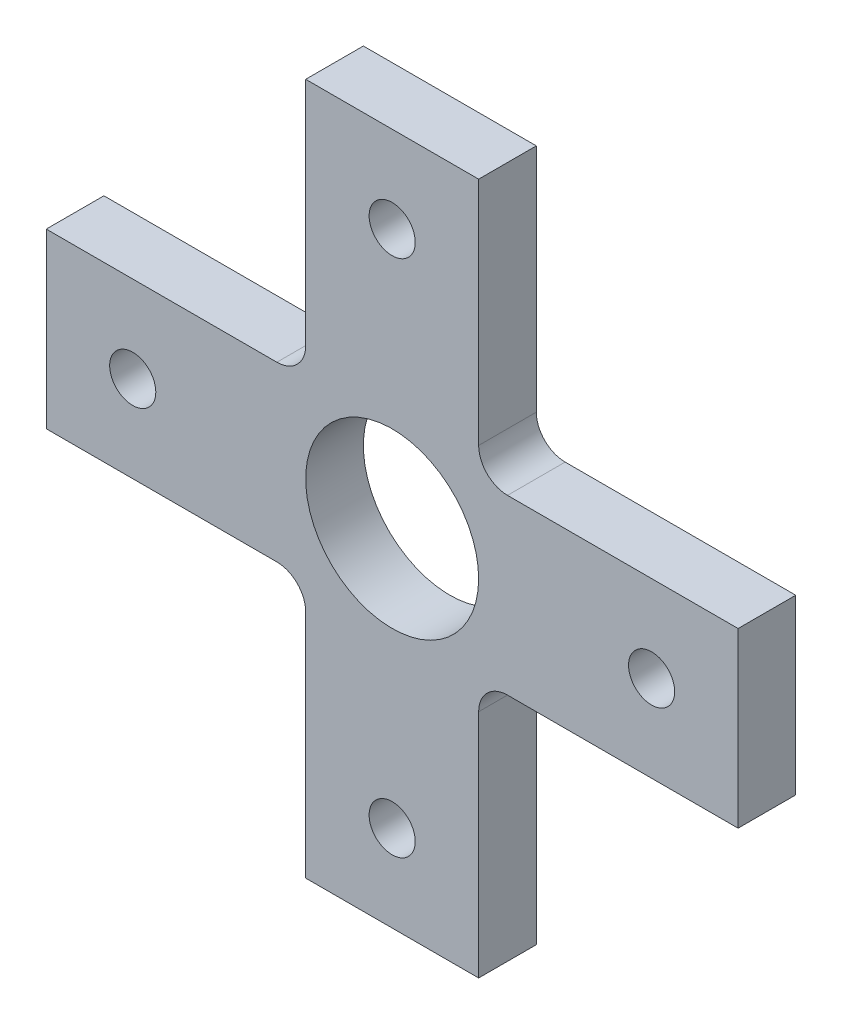
ISO-10303-21;
HEADER;
FILE_DESCRIPTION(('STEP AP214'),'2;1');
FILE_NAME('part.step','',(''),(''),'','','');
FILE_SCHEMA(('AUTOMOTIVE_DESIGN { 1 0 10303 214 1 1 1 1 }'));
ENDSEC;
DATA;
#1=APPLICATION_CONTEXT('core data for automotive mechanical design processes');
#2=APPLICATION_PROTOCOL_DEFINITION('international standard','automotive_design',2000,#1);
#3=PRODUCT_CONTEXT('',#1,'mechanical');
#4=PRODUCT('Part','Part','',(#3));
#5=PRODUCT_RELATED_PRODUCT_CATEGORY('part','',(#4));
#6=PRODUCT_DEFINITION_FORMATION('','',#4);
#7=PRODUCT_DEFINITION_CONTEXT('part definition',#1,'design');
#8=PRODUCT_DEFINITION('design','',#6,#7);
#9=PRODUCT_DEFINITION_SHAPE('','',#8);
#10=(LENGTH_UNIT() NAMED_UNIT(*) SI_UNIT(.MILLI.,.METRE.));
#11=(NAMED_UNIT(*) PLANE_ANGLE_UNIT() SI_UNIT($,.RADIAN.));
#12=(NAMED_UNIT(*) SI_UNIT($,.STERADIAN.) SOLID_ANGLE_UNIT());
#13=UNCERTAINTY_MEASURE_WITH_UNIT(LENGTH_MEASURE(1.E-05),#10,'distance_accuracy_value','');
#14=(GEOMETRIC_REPRESENTATION_CONTEXT(3) GLOBAL_UNCERTAINTY_ASSIGNED_CONTEXT((#13)) GLOBAL_UNIT_ASSIGNED_CONTEXT((#10,
#11,#12)) REPRESENTATION_CONTEXT('',''));
#15=CARTESIAN_POINT('',(0.,0.,0.));
#16=DIRECTION('',(0.,0.,1.));
#17=DIRECTION('',(1.,0.,0.));
#18=AXIS2_PLACEMENT_3D('',#15,#16,#17);
#19=CARTESIAN_POINT('',(-15.,20.,5.));
#20=DIRECTION('',(1.,0.,0.));
#21=DIRECTION('',(0.,0.,-1.));
#22=AXIS2_PLACEMENT_3D('',#19,#20,#21);
#23=PLANE('',#22);
#24=DIRECTION('',(0.,-1.,0.));
#25=VECTOR('',#24,1.);
#26=CARTESIAN_POINT('',(-15.,20.,-5.));
#27=LINE('',#26,#25);
#28=CARTESIAN_POINT('',(-15.,60.,-5.));
#29=VERTEX_POINT('',#28);
#30=CARTESIAN_POINT('',(-15.,20.,-5.));
#31=VERTEX_POINT('',#30);
#32=EDGE_CURVE('E205',#29,#31,#27,.T.);
#33=ORIENTED_EDGE('',*,*,#32,.T.);
#34=DIRECTION('',(0.,0.,-1.));
#35=VECTOR('',#34,1.);
#36=CARTESIAN_POINT('',(-15.,20.,5.));
#37=LINE('',#36,#35);
#38=CARTESIAN_POINT('',(-15.,20.,5.));
#39=VERTEX_POINT('',#38);
#40=EDGE_CURVE('E11',#39,#31,#37,.T.);
#41=ORIENTED_EDGE('',*,*,#40,.F.);
#42=DIRECTION('',(0.,-1.,0.));
#43=VECTOR('',#42,1.);
#44=CARTESIAN_POINT('',(-15.,20.,5.));
#45=LINE('',#44,#43);
#46=CARTESIAN_POINT('',(-15.,60.,5.));
#47=VERTEX_POINT('',#46);
#48=EDGE_CURVE('E252',#47,#39,#45,.T.);
#49=ORIENTED_EDGE('',*,*,#48,.F.);
#50=DIRECTION('',(0.,0.,-1.));
#51=VECTOR('',#50,1.);
#52=CARTESIAN_POINT('',(-15.,60.,5.));
#53=LINE('',#52,#51);
#54=EDGE_CURVE('E201',#47,#29,#53,.T.);
#55=ORIENTED_EDGE('',*,*,#54,.T.);
#56=EDGE_LOOP('',(#33,#41,#49,#55));
#57=FACE_BOUND('',#56,.T.);
#58=ADVANCED_FACE('F51',(#57),#23,.F.);
#59=CARTESIAN_POINT('',(-20.,20.,5.));
#60=DIRECTION('',(0.,0.,-1.));
#61=DIRECTION('',(-1.,0.,0.));
#62=AXIS2_PLACEMENT_3D('',#59,#60,#61);
#63=CYLINDRICAL_SURFACE('',#62,5.);
#64=CARTESIAN_POINT('',(-20.,20.,-5.));
#65=DIRECTION('',(0.,0.,-1.));
#66=DIRECTION('',(1.,0.,0.));
#67=AXIS2_PLACEMENT_3D('',#64,#65,#66);
#68=CIRCLE('',#67,5.);
#69=CARTESIAN_POINT('',(-20.,15.,-5.));
#70=VERTEX_POINT('',#69);
#71=EDGE_CURVE('E209',#31,#70,#68,.T.);
#72=ORIENTED_EDGE('',*,*,#71,.T.);
#73=DIRECTION('',(0.,0.,-1.));
#74=VECTOR('',#73,1.);
#75=CARTESIAN_POINT('',(-20.,15.,5.));
#76=LINE('',#75,#74);
#77=CARTESIAN_POINT('',(-20.,15.,5.));
#78=VERTEX_POINT('',#77);
#79=EDGE_CURVE('E62',#78,#70,#76,.T.);
#80=ORIENTED_EDGE('',*,*,#79,.F.);
#81=CARTESIAN_POINT('',(-20.,20.,5.));
#82=DIRECTION('',(0.,0.,-1.));
#83=DIRECTION('',(1.,0.,0.));
#84=AXIS2_PLACEMENT_3D('',#81,#82,#83);
#85=CIRCLE('',#84,5.);
#86=EDGE_CURVE('E138',#39,#78,#85,.T.);
#87=ORIENTED_EDGE('',*,*,#86,.F.);
#88=ORIENTED_EDGE('',*,*,#40,.T.);
#89=EDGE_LOOP('',(#72,#80,#87,#88));
#90=FACE_BOUND('',#89,.T.);
#91=ADVANCED_FACE('F400',(#90),#63,.F.);
#92=CARTESIAN_POINT('',(-60.,15.,5.));
#93=DIRECTION('',(0.,-1.,0.));
#94=DIRECTION('',(0.,0.,-1.));
#95=AXIS2_PLACEMENT_3D('',#92,#93,#94);
#96=PLANE('',#95);
#97=DIRECTION('',(-1.,0.,0.));
#98=VECTOR('',#97,1.);
#99=CARTESIAN_POINT('',(-60.,15.,-5.));
#100=LINE('',#99,#98);
#101=CARTESIAN_POINT('',(-60.,15.,-5.));
#102=VERTEX_POINT('',#101);
#103=EDGE_CURVE('E213',#70,#102,#100,.T.);
#104=ORIENTED_EDGE('',*,*,#103,.T.);
#105=DIRECTION('',(0.,0.,-1.));
#106=VECTOR('',#105,1.);
#107=CARTESIAN_POINT('',(-60.,15.,5.));
#108=LINE('',#107,#106);
#109=CARTESIAN_POINT('',(-60.,15.,5.));
#110=VERTEX_POINT('',#109);
#111=EDGE_CURVE('E294',#110,#102,#108,.T.);
#112=ORIENTED_EDGE('',*,*,#111,.F.);
#113=DIRECTION('',(-1.,0.,0.));
#114=VECTOR('',#113,1.);
#115=CARTESIAN_POINT('',(-60.,15.,5.));
#116=LINE('',#115,#114);
#117=EDGE_CURVE('E341',#78,#110,#116,.T.);
#118=ORIENTED_EDGE('',*,*,#117,.F.);
#119=ORIENTED_EDGE('',*,*,#79,.T.);
#120=EDGE_LOOP('',(#104,#112,#118,#119));
#121=FACE_BOUND('',#120,.T.);
#122=ADVANCED_FACE('F403',(#121),#96,.F.);
#123=CARTESIAN_POINT('',(-60.,-15.,5.));
#124=DIRECTION('',(1.,0.,0.));
#125=DIRECTION('',(0.,0.,-1.));
#126=AXIS2_PLACEMENT_3D('',#123,#124,#125);
#127=PLANE('',#126);
#128=DIRECTION('',(0.,-1.,0.));
#129=VECTOR('',#128,1.);
#130=CARTESIAN_POINT('',(-60.,-15.,-5.));
#131=LINE('',#130,#129);
#132=CARTESIAN_POINT('',(-60.,-15.,-5.));
#133=VERTEX_POINT('',#132);
#134=EDGE_CURVE('E216',#102,#133,#131,.T.);
#135=ORIENTED_EDGE('',*,*,#134,.T.);
#136=DIRECTION('',(0.,0.,-1.));
#137=VECTOR('',#136,1.);
#138=CARTESIAN_POINT('',(-60.,-15.,5.));
#139=LINE('',#138,#137);
#140=CARTESIAN_POINT('',(-60.,-15.,5.));
#141=VERTEX_POINT('',#140);
#142=EDGE_CURVE('E290',#141,#133,#139,.T.);
#143=ORIENTED_EDGE('',*,*,#142,.F.);
#144=DIRECTION('',(0.,-1.,0.));
#145=VECTOR('',#144,1.);
#146=CARTESIAN_POINT('',(-60.,-15.,5.));
#147=LINE('',#146,#145);
#148=EDGE_CURVE('E344',#110,#141,#147,.T.);
#149=ORIENTED_EDGE('',*,*,#148,.F.);
#150=ORIENTED_EDGE('',*,*,#111,.T.);
#151=EDGE_LOOP('',(#135,#143,#149,#150));
#152=FACE_BOUND('',#151,.T.);
#153=ADVANCED_FACE('F406',(#152),#127,.F.);
#154=CARTESIAN_POINT('',(-20.,-15.,5.));
#155=DIRECTION('',(0.,1.,0.));
#156=DIRECTION('',(0.,0.,1.));
#157=AXIS2_PLACEMENT_3D('',#154,#155,#156);
#158=PLANE('',#157);
#159=DIRECTION('',(1.,0.,0.));
#160=VECTOR('',#159,1.);
#161=CARTESIAN_POINT('',(-20.,-15.,-5.));
#162=LINE('',#161,#160);
#163=CARTESIAN_POINT('',(-20.,-15.,-5.));
#164=VERTEX_POINT('',#163);
#165=EDGE_CURVE('E219',#133,#164,#162,.T.);
#166=ORIENTED_EDGE('',*,*,#165,.T.);
#167=DIRECTION('',(0.,0.,-1.));
#168=VECTOR('',#167,1.);
#169=CARTESIAN_POINT('',(-20.,-15.,5.));
#170=LINE('',#169,#168);
#171=CARTESIAN_POINT('',(-20.,-15.,5.));
#172=VERTEX_POINT('',#171);
#173=EDGE_CURVE('E286',#172,#164,#170,.T.);
#174=ORIENTED_EDGE('',*,*,#173,.F.);
#175=DIRECTION('',(1.,0.,0.));
#176=VECTOR('',#175,1.);
#177=CARTESIAN_POINT('',(-20.,-15.,5.));
#178=LINE('',#177,#176);
#179=EDGE_CURVE('E347',#141,#172,#178,.T.);
#180=ORIENTED_EDGE('',*,*,#179,.F.);
#181=ORIENTED_EDGE('',*,*,#142,.T.);
#182=EDGE_LOOP('',(#166,#174,#180,#181));
#183=FACE_BOUND('',#182,.T.);
#184=ADVANCED_FACE('F416',(#183),#158,.F.);
#185=CARTESIAN_POINT('',(-20.,-20.,5.));
#186=DIRECTION('',(0.,0.,-1.));
#187=DIRECTION('',(-1.,0.,0.));
#188=AXIS2_PLACEMENT_3D('',#185,#186,#187);
#189=CYLINDRICAL_SURFACE('',#188,5.);
#190=CARTESIAN_POINT('',(-20.,-20.,-5.));
#191=DIRECTION('',(0.,0.,-1.));
#192=DIRECTION('',(1.,0.,0.));
#193=AXIS2_PLACEMENT_3D('',#190,#191,#192);
#194=CIRCLE('',#193,5.);
#195=CARTESIAN_POINT('',(-15.,-20.,-5.));
#196=VERTEX_POINT('',#195);
#197=EDGE_CURVE('E222',#164,#196,#194,.T.);
#198=ORIENTED_EDGE('',*,*,#197,.T.);
#199=DIRECTION('',(0.,0.,-1.));
#200=VECTOR('',#199,1.);
#201=CARTESIAN_POINT('',(-15.,-20.,5.));
#202=LINE('',#201,#200);
#203=CARTESIAN_POINT('',(-15.,-20.,5.));
#204=VERTEX_POINT('',#203);
#205=EDGE_CURVE('E282',#204,#196,#202,.T.);
#206=ORIENTED_EDGE('',*,*,#205,.F.);
#207=CARTESIAN_POINT('',(-20.,-20.,5.));
#208=DIRECTION('',(0.,0.,-1.));
#209=DIRECTION('',(1.,0.,0.));
#210=AXIS2_PLACEMENT_3D('',#207,#208,#209);
#211=CIRCLE('',#210,5.);
#212=EDGE_CURVE('E350',#172,#204,#211,.T.);
#213=ORIENTED_EDGE('',*,*,#212,.F.);
#214=ORIENTED_EDGE('',*,*,#173,.T.);
#215=EDGE_LOOP('',(#198,#206,#213,#214));
#216=FACE_BOUND('',#215,.T.);
#217=ADVANCED_FACE('F421',(#216),#189,.F.);
#218=CARTESIAN_POINT('',(-15.,-60.,5.));
#219=DIRECTION('',(1.,0.,0.));
#220=DIRECTION('',(0.,0.,-1.));
#221=AXIS2_PLACEMENT_3D('',#218,#219,#220);
#222=PLANE('',#221);
#223=DIRECTION('',(0.,-1.,0.));
#224=VECTOR('',#223,1.);
#225=CARTESIAN_POINT('',(-15.,-60.,-5.));
#226=LINE('',#225,#224);
#227=CARTESIAN_POINT('',(-15.,-60.,-5.));
#228=VERTEX_POINT('',#227);
#229=EDGE_CURVE('E225',#196,#228,#226,.T.);
#230=ORIENTED_EDGE('',*,*,#229,.T.);
#231=DIRECTION('',(0.,0.,-1.));
#232=VECTOR('',#231,1.);
#233=CARTESIAN_POINT('',(-15.,-60.,5.));
#234=LINE('',#233,#232);
#235=CARTESIAN_POINT('',(-15.,-60.,5.));
#236=VERTEX_POINT('',#235);
#237=EDGE_CURVE('E278',#236,#228,#234,.T.);
#238=ORIENTED_EDGE('',*,*,#237,.F.);
#239=DIRECTION('',(0.,-1.,0.));
#240=VECTOR('',#239,1.);
#241=CARTESIAN_POINT('',(-15.,-60.,5.));
#242=LINE('',#241,#240);
#243=EDGE_CURVE('E353',#204,#236,#242,.T.);
#244=ORIENTED_EDGE('',*,*,#243,.F.);
#245=ORIENTED_EDGE('',*,*,#205,.T.);
#246=EDGE_LOOP('',(#230,#238,#244,#245));
#247=FACE_BOUND('',#246,.T.);
#248=ADVANCED_FACE('F426',(#247),#222,.F.);
#249=CARTESIAN_POINT('',(15.,-60.,5.));
#250=DIRECTION('',(0.,1.,0.));
#251=DIRECTION('',(0.,0.,1.));
#252=AXIS2_PLACEMENT_3D('',#249,#250,#251);
#253=PLANE('',#252);
#254=DIRECTION('',(1.,0.,0.));
#255=VECTOR('',#254,1.);
#256=CARTESIAN_POINT('',(15.,-60.,-5.));
#257=LINE('',#256,#255);
#258=CARTESIAN_POINT('',(15.,-60.,-5.));
#259=VERTEX_POINT('',#258);
#260=EDGE_CURVE('E228',#228,#259,#257,.T.);
#261=ORIENTED_EDGE('',*,*,#260,.T.);
#262=DIRECTION('',(0.,0.,-1.));
#263=VECTOR('',#262,1.);
#264=CARTESIAN_POINT('',(15.,-60.,5.));
#265=LINE('',#264,#263);
#266=CARTESIAN_POINT('',(15.,-60.,5.));
#267=VERTEX_POINT('',#266);
#268=EDGE_CURVE('E274',#267,#259,#265,.T.);
#269=ORIENTED_EDGE('',*,*,#268,.F.);
#270=DIRECTION('',(1.,0.,0.));
#271=VECTOR('',#270,1.);
#272=CARTESIAN_POINT('',(15.,-60.,5.));
#273=LINE('',#272,#271);
#274=EDGE_CURVE('E356',#236,#267,#273,.T.);
#275=ORIENTED_EDGE('',*,*,#274,.F.);
#276=ORIENTED_EDGE('',*,*,#237,.T.);
#277=EDGE_LOOP('',(#261,#269,#275,#276));
#278=FACE_BOUND('',#277,.T.);
#279=ADVANCED_FACE('F430',(#278),#253,.F.);
#280=CARTESIAN_POINT('',(15.,-20.,5.));
#281=DIRECTION('',(-1.,0.,0.));
#282=DIRECTION('',(0.,0.,1.));
#283=AXIS2_PLACEMENT_3D('',#280,#281,#282);
#284=PLANE('',#283);
#285=DIRECTION('',(0.,1.,0.));
#286=VECTOR('',#285,1.);
#287=CARTESIAN_POINT('',(15.,-20.,-5.));
#288=LINE('',#287,#286);
#289=CARTESIAN_POINT('',(15.,-20.,-5.));
#290=VERTEX_POINT('',#289);
#291=EDGE_CURVE('E231',#259,#290,#288,.T.);
#292=ORIENTED_EDGE('',*,*,#291,.T.);
#293=DIRECTION('',(0.,0.,-1.));
#294=VECTOR('',#293,1.);
#295=CARTESIAN_POINT('',(15.,-20.,5.));
#296=LINE('',#295,#294);
#297=CARTESIAN_POINT('',(15.,-20.,5.));
#298=VERTEX_POINT('',#297);
#299=EDGE_CURVE('E270',#298,#290,#296,.T.);
#300=ORIENTED_EDGE('',*,*,#299,.F.);
#301=DIRECTION('',(0.,1.,0.));
#302=VECTOR('',#301,1.);
#303=CARTESIAN_POINT('',(15.,-20.,5.));
#304=LINE('',#303,#302);
#305=EDGE_CURVE('E359',#267,#298,#304,.T.);
#306=ORIENTED_EDGE('',*,*,#305,.F.);
#307=ORIENTED_EDGE('',*,*,#268,.T.);
#308=EDGE_LOOP('',(#292,#300,#306,#307));
#309=FACE_BOUND('',#308,.T.);
#310=ADVANCED_FACE('F436',(#309),#284,.F.);
#311=CARTESIAN_POINT('',(20.,-20.,5.));
#312=DIRECTION('',(0.,0.,-1.));
#313=DIRECTION('',(-1.,0.,0.));
#314=AXIS2_PLACEMENT_3D('',#311,#312,#313);
#315=CYLINDRICAL_SURFACE('',#314,5.);
#316=CARTESIAN_POINT('',(20.,-20.,-5.));
#317=DIRECTION('',(0.,0.,-1.));
#318=DIRECTION('',(1.,0.,0.));
#319=AXIS2_PLACEMENT_3D('',#316,#317,#318);
#320=CIRCLE('',#319,5.);
#321=CARTESIAN_POINT('',(20.,-15.,-5.));
#322=VERTEX_POINT('',#321);
#323=EDGE_CURVE('E234',#290,#322,#320,.T.);
#324=ORIENTED_EDGE('',*,*,#323,.T.);
#325=DIRECTION('',(0.,0.,-1.));
#326=VECTOR('',#325,1.);
#327=CARTESIAN_POINT('',(20.,-15.,5.));
#328=LINE('',#327,#326);
#329=CARTESIAN_POINT('',(20.,-15.,5.));
#330=VERTEX_POINT('',#329);
#331=EDGE_CURVE('E266',#330,#322,#328,.T.);
#332=ORIENTED_EDGE('',*,*,#331,.F.);
#333=CARTESIAN_POINT('',(20.,-20.,5.));
#334=DIRECTION('',(0.,0.,-1.));
#335=DIRECTION('',(1.,0.,0.));
#336=AXIS2_PLACEMENT_3D('',#333,#334,#335);
#337=CIRCLE('',#336,5.);
#338=EDGE_CURVE('E362',#298,#330,#337,.T.);
#339=ORIENTED_EDGE('',*,*,#338,.F.);
#340=ORIENTED_EDGE('',*,*,#299,.T.);
#341=EDGE_LOOP('',(#324,#332,#339,#340));
#342=FACE_BOUND('',#341,.T.);
#343=ADVANCED_FACE('F441',(#342),#315,.F.);
#344=CARTESIAN_POINT('',(60.,-15.,5.));
#345=DIRECTION('',(0.,1.,0.));
#346=DIRECTION('',(0.,0.,1.));
#347=AXIS2_PLACEMENT_3D('',#344,#345,#346);
#348=PLANE('',#347);
#349=DIRECTION('',(1.,0.,0.));
#350=VECTOR('',#349,1.);
#351=CARTESIAN_POINT('',(60.,-15.,-5.));
#352=LINE('',#351,#350);
#353=CARTESIAN_POINT('',(60.,-15.,-5.));
#354=VERTEX_POINT('',#353);
#355=EDGE_CURVE('E237',#322,#354,#352,.T.);
#356=ORIENTED_EDGE('',*,*,#355,.T.);
#357=DIRECTION('',(0.,0.,-1.));
#358=VECTOR('',#357,1.);
#359=CARTESIAN_POINT('',(60.,-15.,5.));
#360=LINE('',#359,#358);
#361=CARTESIAN_POINT('',(60.,-15.,5.));
#362=VERTEX_POINT('',#361);
#363=EDGE_CURVE('E262',#362,#354,#360,.T.);
#364=ORIENTED_EDGE('',*,*,#363,.F.);
#365=DIRECTION('',(1.,0.,0.));
#366=VECTOR('',#365,1.);
#367=CARTESIAN_POINT('',(60.,-15.,5.));
#368=LINE('',#367,#366);
#369=EDGE_CURVE('E365',#330,#362,#368,.T.);
#370=ORIENTED_EDGE('',*,*,#369,.F.);
#371=ORIENTED_EDGE('',*,*,#331,.T.);
#372=EDGE_LOOP('',(#356,#364,#370,#371));
#373=FACE_BOUND('',#372,.T.);
#374=ADVANCED_FACE('F446',(#373),#348,.F.);
#375=CARTESIAN_POINT('',(60.,15.,5.));
#376=DIRECTION('',(-1.,0.,0.));
#377=DIRECTION('',(0.,0.,1.));
#378=AXIS2_PLACEMENT_3D('',#375,#376,#377);
#379=PLANE('',#378);
#380=DIRECTION('',(0.,1.,0.));
#381=VECTOR('',#380,1.);
#382=CARTESIAN_POINT('',(60.,15.,-5.));
#383=LINE('',#382,#381);
#384=CARTESIAN_POINT('',(60.,15.,-5.));
#385=VERTEX_POINT('',#384);
#386=EDGE_CURVE('E240',#354,#385,#383,.T.);
#387=ORIENTED_EDGE('',*,*,#386,.T.);
#388=DIRECTION('',(0.,0.,-1.));
#389=VECTOR('',#388,1.);
#390=CARTESIAN_POINT('',(60.,15.,5.));
#391=LINE('',#390,#389);
#392=CARTESIAN_POINT('',(60.,15.,5.));
#393=VERTEX_POINT('',#392);
#394=EDGE_CURVE('E259',#393,#385,#391,.T.);
#395=ORIENTED_EDGE('',*,*,#394,.F.);
#396=DIRECTION('',(0.,1.,0.));
#397=VECTOR('',#396,1.);
#398=CARTESIAN_POINT('',(60.,15.,5.));
#399=LINE('',#398,#397);
#400=EDGE_CURVE('E368',#362,#393,#399,.T.);
#401=ORIENTED_EDGE('',*,*,#400,.F.);
#402=ORIENTED_EDGE('',*,*,#363,.T.);
#403=EDGE_LOOP('',(#387,#395,#401,#402));
#404=FACE_BOUND('',#403,.T.);
#405=ADVANCED_FACE('F376',(#404),#379,.F.);
#406=CARTESIAN_POINT('',(20.,15.,5.));
#407=DIRECTION('',(0.,-1.,0.));
#408=DIRECTION('',(0.,0.,-1.));
#409=AXIS2_PLACEMENT_3D('',#406,#407,#408);
#410=PLANE('',#409);
#411=DIRECTION('',(-1.,0.,0.));
#412=VECTOR('',#411,1.);
#413=CARTESIAN_POINT('',(20.,15.,-5.));
#414=LINE('',#413,#412);
#415=CARTESIAN_POINT('',(20.,15.,-5.));
#416=VERTEX_POINT('',#415);
#417=EDGE_CURVE('E243',#385,#416,#414,.T.);
#418=ORIENTED_EDGE('',*,*,#417,.T.);
#419=DIRECTION('',(0.,0.,-1.));
#420=VECTOR('',#419,1.);
#421=CARTESIAN_POINT('',(20.,15.,5.));
#422=LINE('',#421,#420);
#423=CARTESIAN_POINT('',(20.,15.,5.));
#424=VERTEX_POINT('',#423);
#425=EDGE_CURVE('E192',#424,#416,#422,.T.);
#426=ORIENTED_EDGE('',*,*,#425,.F.);
#427=DIRECTION('',(-1.,0.,0.));
#428=VECTOR('',#427,1.);
#429=CARTESIAN_POINT('',(20.,15.,5.));
#430=LINE('',#429,#428);
#431=EDGE_CURVE('E181',#393,#424,#430,.T.);
#432=ORIENTED_EDGE('',*,*,#431,.F.);
#433=ORIENTED_EDGE('',*,*,#394,.T.);
#434=EDGE_LOOP('',(#418,#426,#432,#433));
#435=FACE_BOUND('',#434,.T.);
#436=ADVANCED_FACE('F380',(#435),#410,.F.);
#437=CARTESIAN_POINT('',(20.,20.,5.));
#438=DIRECTION('',(0.,0.,-1.));
#439=DIRECTION('',(-1.,0.,0.));
#440=AXIS2_PLACEMENT_3D('',#437,#438,#439);
#441=CYLINDRICAL_SURFACE('',#440,5.);
#442=CARTESIAN_POINT('',(20.,20.,-5.));
#443=DIRECTION('',(0.,0.,-1.));
#444=DIRECTION('',(1.,0.,0.));
#445=AXIS2_PLACEMENT_3D('',#442,#443,#444);
#446=CIRCLE('',#445,5.);
#447=CARTESIAN_POINT('',(15.,20.,-5.));
#448=VERTEX_POINT('',#447);
#449=EDGE_CURVE('E190',#416,#448,#446,.T.);
#450=ORIENTED_EDGE('',*,*,#449,.T.);
#451=DIRECTION('',(0.,0.,-1.));
#452=VECTOR('',#451,1.);
#453=CARTESIAN_POINT('',(15.,20.,5.));
#454=LINE('',#453,#452);
#455=CARTESIAN_POINT('',(15.,20.,5.));
#456=VERTEX_POINT('',#455);
#457=EDGE_CURVE('E187',#456,#448,#454,.T.);
#458=ORIENTED_EDGE('',*,*,#457,.F.);
#459=CARTESIAN_POINT('',(20.,20.,5.));
#460=DIRECTION('',(0.,0.,-1.));
#461=DIRECTION('',(1.,0.,0.));
#462=AXIS2_PLACEMENT_3D('',#459,#460,#461);
#463=CIRCLE('',#462,5.);
#464=EDGE_CURVE('E175',#424,#456,#463,.T.);
#465=ORIENTED_EDGE('',*,*,#464,.F.);
#466=ORIENTED_EDGE('',*,*,#425,.T.);
#467=EDGE_LOOP('',(#450,#458,#465,#466));
#468=FACE_BOUND('',#467,.T.);
#469=ADVANCED_FACE('F188',(#468),#441,.F.);
#470=CARTESIAN_POINT('',(15.,60.,5.));
#471=DIRECTION('',(-1.,0.,0.));
#472=DIRECTION('',(0.,0.,1.));
#473=AXIS2_PLACEMENT_3D('',#470,#471,#472);
#474=PLANE('',#473);
#475=DIRECTION('',(0.,1.,0.));
#476=VECTOR('',#475,1.);
#477=CARTESIAN_POINT('',(15.,60.,-5.));
#478=LINE('',#477,#476);
#479=CARTESIAN_POINT('',(15.,60.,-5.));
#480=VERTEX_POINT('',#479);
#481=EDGE_CURVE('E124',#448,#480,#478,.T.);
#482=ORIENTED_EDGE('',*,*,#481,.T.);
#483=DIRECTION('',(0.,0.,-1.));
#484=VECTOR('',#483,1.);
#485=CARTESIAN_POINT('',(15.,60.,5.));
#486=LINE('',#485,#484);
#487=CARTESIAN_POINT('',(15.,60.,5.));
#488=VERTEX_POINT('',#487);
#489=EDGE_CURVE('E193',#488,#480,#486,.T.);
#490=ORIENTED_EDGE('',*,*,#489,.F.);
#491=DIRECTION('',(0.,1.,0.));
#492=VECTOR('',#491,1.);
#493=CARTESIAN_POINT('',(15.,60.,5.));
#494=LINE('',#493,#492);
#495=EDGE_CURVE('E179',#456,#488,#494,.T.);
#496=ORIENTED_EDGE('',*,*,#495,.F.);
#497=ORIENTED_EDGE('',*,*,#457,.T.);
#498=EDGE_LOOP('',(#482,#490,#496,#497));
#499=FACE_BOUND('',#498,.T.);
#500=ADVANCED_FACE('F195',(#499),#474,.F.);
#501=CARTESIAN_POINT('',(-15.,60.,5.));
#502=DIRECTION('',(0.,-1.,0.));
#503=DIRECTION('',(0.,0.,-1.));
#504=AXIS2_PLACEMENT_3D('',#501,#502,#503);
#505=PLANE('',#504);
#506=DIRECTION('',(-1.,0.,0.));
#507=VECTOR('',#506,1.);
#508=CARTESIAN_POINT('',(-15.,60.,-5.));
#509=LINE('',#508,#507);
#510=EDGE_CURVE('E130',#480,#29,#509,.T.);
#511=ORIENTED_EDGE('',*,*,#510,.T.);
#512=ORIENTED_EDGE('',*,*,#54,.F.);
#513=DIRECTION('',(-1.,0.,0.));
#514=VECTOR('',#513,1.);
#515=CARTESIAN_POINT('',(-15.,60.,5.));
#516=LINE('',#515,#514);
#517=EDGE_CURVE('E71',#488,#47,#516,.T.);
#518=ORIENTED_EDGE('',*,*,#517,.F.);
#519=ORIENTED_EDGE('',*,*,#489,.T.);
#520=EDGE_LOOP('',(#511,#512,#518,#519));
#521=FACE_BOUND('',#520,.T.);
#522=ADVANCED_FACE('F388',(#521),#505,.F.);
#523=CARTESIAN_POINT('',(20.,20.,5.));
#524=DIRECTION('',(0.,0.,1.));
#525=DIRECTION('',(1.,0.,0.));
#526=AXIS2_PLACEMENT_3D('',#523,#524,#525);
#527=PLANE('',#526);
#528=CARTESIAN_POINT('',(45.,0.,5.));
#529=DIRECTION('',(0.,0.,1.));
#530=DIRECTION('',(1.,0.,0.));
#531=AXIS2_PLACEMENT_3D('',#528,#529,#530);
#532=CIRCLE('',#531,4.);
#533=CARTESIAN_POINT('',(49.,0.,5.));
#534=VERTEX_POINT('',#533);
#535=EDGE_CURVE('E305',#534,#534,#532,.T.);
#536=ORIENTED_EDGE('',*,*,#535,.F.);
#537=EDGE_LOOP('',(#536));
#538=FACE_BOUND('',#537,.T.);
#539=CARTESIAN_POINT('',(-45.,0.,5.));
#540=DIRECTION('',(0.,0.,1.));
#541=DIRECTION('',(1.,0.,0.));
#542=AXIS2_PLACEMENT_3D('',#539,#540,#541);
#543=CIRCLE('',#542,4.);
#544=CARTESIAN_POINT('',(-41.,0.,5.));
#545=VERTEX_POINT('',#544);
#546=EDGE_CURVE('E318',#545,#545,#543,.T.);
#547=ORIENTED_EDGE('',*,*,#546,.F.);
#548=EDGE_LOOP('',(#547));
#549=FACE_BOUND('',#548,.T.);
#550=CARTESIAN_POINT('',(0.,45.,5.));
#551=DIRECTION('',(0.,0.,1.));
#552=DIRECTION('',(1.,0.,0.));
#553=AXIS2_PLACEMENT_3D('',#550,#551,#552);
#554=CIRCLE('',#553,4.);
#555=CARTESIAN_POINT('',(4.,45.,5.));
#556=VERTEX_POINT('',#555);
#557=EDGE_CURVE('E314',#556,#556,#554,.T.);
#558=ORIENTED_EDGE('',*,*,#557,.F.);
#559=EDGE_LOOP('',(#558));
#560=FACE_BOUND('',#559,.T.);
#561=CARTESIAN_POINT('',(0.,-45.,5.));
#562=DIRECTION('',(0.,0.,1.));
#563=DIRECTION('',(1.,0.,0.));
#564=AXIS2_PLACEMENT_3D('',#561,#562,#563);
#565=CIRCLE('',#564,4.);
#566=CARTESIAN_POINT('',(4.,-45.,5.));
#567=VERTEX_POINT('',#566);
#568=EDGE_CURVE('E310',#567,#567,#565,.T.);
#569=ORIENTED_EDGE('',*,*,#568,.F.);
#570=EDGE_LOOP('',(#569));
#571=FACE_BOUND('',#570,.T.);
#572=CARTESIAN_POINT('',(0.,0.,5.));
#573=DIRECTION('',(0.,0.,1.));
#574=DIRECTION('',(1.,0.,0.));
#575=AXIS2_PLACEMENT_3D('',#572,#573,#574);
#576=CIRCLE('',#575,15.);
#577=CARTESIAN_POINT('',(15.,0.,5.));
#578=VERTEX_POINT('',#577);
#579=EDGE_CURVE('E210',#578,#578,#576,.T.);
#580=ORIENTED_EDGE('',*,*,#579,.F.);
#581=EDGE_LOOP('',(#580));
#582=FACE_BOUND('',#581,.T.);
#583=ORIENTED_EDGE('',*,*,#48,.T.);
#584=ORIENTED_EDGE('',*,*,#86,.T.);
#585=ORIENTED_EDGE('',*,*,#117,.T.);
#586=ORIENTED_EDGE('',*,*,#148,.T.);
#587=ORIENTED_EDGE('',*,*,#179,.T.);
#588=ORIENTED_EDGE('',*,*,#212,.T.);
#589=ORIENTED_EDGE('',*,*,#243,.T.);
#590=ORIENTED_EDGE('',*,*,#274,.T.);
#591=ORIENTED_EDGE('',*,*,#305,.T.);
#592=ORIENTED_EDGE('',*,*,#338,.T.);
#593=ORIENTED_EDGE('',*,*,#369,.T.);
#594=ORIENTED_EDGE('',*,*,#400,.T.);
#595=ORIENTED_EDGE('',*,*,#431,.T.);
#596=ORIENTED_EDGE('',*,*,#464,.T.);
#597=ORIENTED_EDGE('',*,*,#495,.T.);
#598=ORIENTED_EDGE('',*,*,#517,.T.);
#599=EDGE_LOOP('',(#583,#584,#585,#586,#587,#588,#589,#590,#591,#592,#593,#594,#595,#596,#597,#598));
#600=FACE_BOUND('',#599,.T.);
#601=ADVANCED_FACE('F177',(#538,#549,#560,#571,#582,#600),#527,.T.);
#602=CARTESIAN_POINT('',(20.,20.,-5.));
#603=DIRECTION('',(0.,0.,1.));
#604=DIRECTION('',(1.,0.,0.));
#605=AXIS2_PLACEMENT_3D('',#602,#603,#604);
#606=PLANE('',#605);
#607=CARTESIAN_POINT('',(45.,0.,-5.));
#608=DIRECTION('',(0.,0.,1.));
#609=DIRECTION('',(1.,0.,0.));
#610=AXIS2_PLACEMENT_3D('',#607,#608,#609);
#611=CIRCLE('',#610,4.);
#612=CARTESIAN_POINT('',(49.,0.,-5.));
#613=VERTEX_POINT('',#612);
#614=EDGE_CURVE('E55',#613,#613,#611,.T.);
#615=ORIENTED_EDGE('',*,*,#614,.T.);
#616=EDGE_LOOP('',(#615));
#617=FACE_BOUND('',#616,.T.);
#618=CARTESIAN_POINT('',(-45.,0.,-5.));
#619=DIRECTION('',(0.,0.,1.));
#620=DIRECTION('',(1.,0.,0.));
#621=AXIS2_PLACEMENT_3D('',#618,#619,#620);
#622=CIRCLE('',#621,4.);
#623=CARTESIAN_POINT('',(-41.,0.,-5.));
#624=VERTEX_POINT('',#623);
#625=EDGE_CURVE('E315',#624,#624,#622,.T.);
#626=ORIENTED_EDGE('',*,*,#625,.T.);
#627=EDGE_LOOP('',(#626));
#628=FACE_BOUND('',#627,.T.);
#629=CARTESIAN_POINT('',(0.,45.,-5.));
#630=DIRECTION('',(0.,0.,1.));
#631=DIRECTION('',(1.,0.,0.));
#632=AXIS2_PLACEMENT_3D('',#629,#630,#631);
#633=CIRCLE('',#632,4.);
#634=CARTESIAN_POINT('',(4.,45.,-5.));
#635=VERTEX_POINT('',#634);
#636=EDGE_CURVE('E311',#635,#635,#633,.T.);
#637=ORIENTED_EDGE('',*,*,#636,.T.);
#638=EDGE_LOOP('',(#637));
#639=FACE_BOUND('',#638,.T.);
#640=CARTESIAN_POINT('',(0.,-45.,-5.));
#641=DIRECTION('',(0.,0.,1.));
#642=DIRECTION('',(1.,0.,0.));
#643=AXIS2_PLACEMENT_3D('',#640,#641,#642);
#644=CIRCLE('',#643,4.);
#645=CARTESIAN_POINT('',(4.,-45.,-5.));
#646=VERTEX_POINT('',#645);
#647=EDGE_CURVE('E306',#646,#646,#644,.T.);
#648=ORIENTED_EDGE('',*,*,#647,.T.);
#649=EDGE_LOOP('',(#648));
#650=FACE_BOUND('',#649,.T.);
#651=CARTESIAN_POINT('',(0.,0.,-5.));
#652=DIRECTION('',(0.,0.,1.));
#653=DIRECTION('',(1.,0.,0.));
#654=AXIS2_PLACEMENT_3D('',#651,#652,#653);
#655=CIRCLE('',#654,15.);
#656=CARTESIAN_POINT('',(15.,0.,-5.));
#657=VERTEX_POINT('',#656);
#658=EDGE_CURVE('E301',#657,#657,#655,.T.);
#659=ORIENTED_EDGE('',*,*,#658,.T.);
#660=EDGE_LOOP('',(#659));
#661=FACE_BOUND('',#660,.T.);
#662=ORIENTED_EDGE('',*,*,#32,.F.);
#663=ORIENTED_EDGE('',*,*,#510,.F.);
#664=ORIENTED_EDGE('',*,*,#481,.F.);
#665=ORIENTED_EDGE('',*,*,#449,.F.);
#666=ORIENTED_EDGE('',*,*,#417,.F.);
#667=ORIENTED_EDGE('',*,*,#386,.F.);
#668=ORIENTED_EDGE('',*,*,#355,.F.);
#669=ORIENTED_EDGE('',*,*,#323,.F.);
#670=ORIENTED_EDGE('',*,*,#291,.F.);
#671=ORIENTED_EDGE('',*,*,#260,.F.);
#672=ORIENTED_EDGE('',*,*,#229,.F.);
#673=ORIENTED_EDGE('',*,*,#197,.F.);
#674=ORIENTED_EDGE('',*,*,#165,.F.);
#675=ORIENTED_EDGE('',*,*,#134,.F.);
#676=ORIENTED_EDGE('',*,*,#103,.F.);
#677=ORIENTED_EDGE('',*,*,#71,.F.);
#678=EDGE_LOOP('',(#662,#663,#664,#665,#666,#667,#668,#669,#670,#671,#672,#673,#674,#675,#676,#677));
#679=FACE_BOUND('',#678,.T.);
#680=ADVANCED_FACE('F383',(#617,#628,#639,#650,#661,#679),#606,.F.);
#681=CARTESIAN_POINT('',(0.,0.,-126.));
#682=DIRECTION('',(0.,0.,1.));
#683=DIRECTION('',(1.,0.,0.));
#684=AXIS2_PLACEMENT_3D('',#681,#682,#683);
#685=CYLINDRICAL_SURFACE('',#684,15.);
#686=ORIENTED_EDGE('',*,*,#579,.T.);
#687=EDGE_LOOP('',(#686));
#688=FACE_BOUND('',#687,.T.);
#689=ORIENTED_EDGE('',*,*,#658,.F.);
#690=EDGE_LOOP('',(#689));
#691=FACE_BOUND('',#690,.T.);
#692=ADVANCED_FACE('F465',(#688,#691),#685,.F.);
#693=CARTESIAN_POINT('',(0.,-45.,-126.));
#694=DIRECTION('',(0.,0.,1.));
#695=DIRECTION('',(1.,0.,0.));
#696=AXIS2_PLACEMENT_3D('',#693,#694,#695);
#697=CYLINDRICAL_SURFACE('',#696,4.);
#698=ORIENTED_EDGE('',*,*,#568,.T.);
#699=EDGE_LOOP('',(#698));
#700=FACE_BOUND('',#699,.T.);
#701=ORIENTED_EDGE('',*,*,#647,.F.);
#702=EDGE_LOOP('',(#701));
#703=FACE_BOUND('',#702,.T.);
#704=ADVANCED_FACE('F468',(#700,#703),#697,.F.);
#705=CARTESIAN_POINT('',(0.,45.,-126.));
#706=DIRECTION('',(0.,0.,1.));
#707=DIRECTION('',(1.,0.,0.));
#708=AXIS2_PLACEMENT_3D('',#705,#706,#707);
#709=CYLINDRICAL_SURFACE('',#708,4.);
#710=ORIENTED_EDGE('',*,*,#557,.T.);
#711=EDGE_LOOP('',(#710));
#712=FACE_BOUND('',#711,.T.);
#713=ORIENTED_EDGE('',*,*,#636,.F.);
#714=EDGE_LOOP('',(#713));
#715=FACE_BOUND('',#714,.T.);
#716=ADVANCED_FACE('F471',(#712,#715),#709,.F.);
#717=CARTESIAN_POINT('',(-45.,0.,-126.));
#718=DIRECTION('',(0.,0.,1.));
#719=DIRECTION('',(1.,0.,0.));
#720=AXIS2_PLACEMENT_3D('',#717,#718,#719);
#721=CYLINDRICAL_SURFACE('',#720,4.);
#722=ORIENTED_EDGE('',*,*,#546,.T.);
#723=EDGE_LOOP('',(#722));
#724=FACE_BOUND('',#723,.T.);
#725=ORIENTED_EDGE('',*,*,#625,.F.);
#726=EDGE_LOOP('',(#725));
#727=FACE_BOUND('',#726,.T.);
#728=ADVANCED_FACE('F474',(#724,#727),#721,.F.);
#729=CARTESIAN_POINT('',(45.,0.,-126.));
#730=DIRECTION('',(0.,0.,1.));
#731=DIRECTION('',(1.,0.,0.));
#732=AXIS2_PLACEMENT_3D('',#729,#730,#731);
#733=CYLINDRICAL_SURFACE('',#732,4.);
#734=ORIENTED_EDGE('',*,*,#535,.T.);
#735=EDGE_LOOP('',(#734));
#736=FACE_BOUND('',#735,.T.);
#737=ORIENTED_EDGE('',*,*,#614,.F.);
#738=EDGE_LOOP('',(#737));
#739=FACE_BOUND('',#738,.T.);
#740=ADVANCED_FACE('F476',(#736,#739),#733,.F.);
#741=CLOSED_SHELL('',(#58,#91,#122,#153,#184,#217,#248,#279,#310,#343,#374,#405,#436,#469,#500,
#522,#601,#680,#692,#704,#716,#728,#740));
#742=MANIFOLD_SOLID_BREP('B2',#741);
#743=ADVANCED_BREP_SHAPE_REPRESENTATION('',(#18,#742),#14);
#744=SHAPE_DEFINITION_REPRESENTATION(#9,#743);
ENDSEC;
END-ISO-10303-21;
